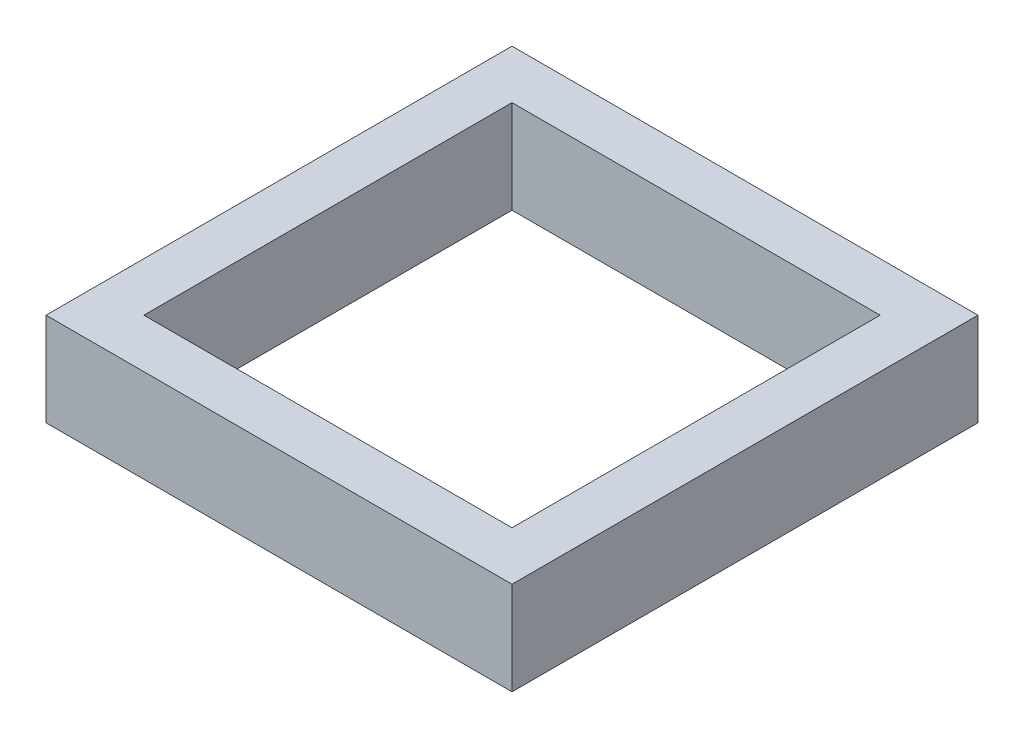
ISO-10303-21;
HEADER;
FILE_DESCRIPTION(('STEP AP214'),'2;1');
FILE_NAME('part.step','',(''),(''),'','','');
FILE_SCHEMA(('AUTOMOTIVE_DESIGN { 1 0 10303 214 1 1 1 1 }'));
ENDSEC;
DATA;
#1=APPLICATION_CONTEXT('core data for automotive mechanical design processes');
#2=APPLICATION_PROTOCOL_DEFINITION('international standard','automotive_design',2000,#1);
#3=PRODUCT_CONTEXT('',#1,'mechanical');
#4=PRODUCT('Part','Part','',(#3));
#5=PRODUCT_RELATED_PRODUCT_CATEGORY('part','',(#4));
#6=PRODUCT_DEFINITION_FORMATION('','',#4);
#7=PRODUCT_DEFINITION_CONTEXT('part definition',#1,'design');
#8=PRODUCT_DEFINITION('design','',#6,#7);
#9=PRODUCT_DEFINITION_SHAPE('','',#8);
#10=(LENGTH_UNIT() NAMED_UNIT(*) SI_UNIT(.MILLI.,.METRE.));
#11=(NAMED_UNIT(*) PLANE_ANGLE_UNIT() SI_UNIT($,.RADIAN.));
#12=(NAMED_UNIT(*) SI_UNIT($,.STERADIAN.) SOLID_ANGLE_UNIT());
#13=UNCERTAINTY_MEASURE_WITH_UNIT(LENGTH_MEASURE(1.E-05),#10,'distance_accuracy_value','');
#14=(GEOMETRIC_REPRESENTATION_CONTEXT(3) GLOBAL_UNCERTAINTY_ASSIGNED_CONTEXT((#13)) GLOBAL_UNIT_ASSIGNED_CONTEXT((#10,
#11,#12)) REPRESENTATION_CONTEXT('',''));
#15=CARTESIAN_POINT('',(0.,0.,0.));
#16=DIRECTION('',(0.,0.,1.));
#17=DIRECTION('',(1.,0.,0.));
#18=AXIS2_PLACEMENT_3D('',#15,#16,#17);
#19=CARTESIAN_POINT('',(0.,40.,0.));
#20=DIRECTION('',(0.,1.,0.));
#21=DIRECTION('',(0.,0.,1.));
#22=AXIS2_PLACEMENT_3D('',#19,#20,#21);
#23=PLANE('',#22);
#24=DIRECTION('',(0.,0.,-1.));
#25=VECTOR('',#24,1.);
#26=CARTESIAN_POINT('',(100.,40.,-100.));
#27=LINE('',#26,#25);
#28=CARTESIAN_POINT('',(100.,40.,100.));
#29=VERTEX_POINT('',#28);
#30=CARTESIAN_POINT('',(100.,40.,-100.));
#31=VERTEX_POINT('',#30);
#32=EDGE_CURVE('E136',#29,#31,#27,.T.);
#33=ORIENTED_EDGE('',*,*,#32,.T.);
#34=DIRECTION('',(-1.,0.,0.));
#35=VECTOR('',#34,1.);
#36=CARTESIAN_POINT('',(-100.,40.,-100.));
#37=LINE('',#36,#35);
#38=CARTESIAN_POINT('',(-100.,40.,-100.));
#39=VERTEX_POINT('',#38);
#40=EDGE_CURVE('E139',#31,#39,#37,.T.);
#41=ORIENTED_EDGE('',*,*,#40,.T.);
#42=DIRECTION('',(0.,0.,1.));
#43=VECTOR('',#42,1.);
#44=CARTESIAN_POINT('',(-100.,40.,-100.));
#45=LINE('',#44,#43);
#46=CARTESIAN_POINT('',(-100.,40.,100.));
#47=VERTEX_POINT('',#46);
#48=EDGE_CURVE('E142',#39,#47,#45,.T.);
#49=ORIENTED_EDGE('',*,*,#48,.T.);
#50=DIRECTION('',(1.,0.,0.));
#51=VECTOR('',#50,1.);
#52=CARTESIAN_POINT('',(-100.,40.,100.));
#53=LINE('',#52,#51);
#54=EDGE_CURVE('E144',#47,#29,#53,.T.);
#55=ORIENTED_EDGE('',*,*,#54,.T.);
#56=EDGE_LOOP('',(#33,#41,#49,#55));
#57=FACE_BOUND('',#56,.T.);
#58=DIRECTION('',(-1.,0.,0.));
#59=VECTOR('',#58,1.);
#60=CARTESIAN_POINT('',(-79.0000000000001,40.,-79.));
#61=LINE('',#60,#59);
#62=CARTESIAN_POINT('',(78.9999999999999,40.,-79.));
#63=VERTEX_POINT('',#62);
#64=CARTESIAN_POINT('',(-79.0000000000001,40.,-79.));
#65=VERTEX_POINT('',#64);
#66=EDGE_CURVE('E108',#63,#65,#61,.T.);
#67=ORIENTED_EDGE('',*,*,#66,.F.);
#68=DIRECTION('',(0.,0.,-1.));
#69=VECTOR('',#68,1.);
#70=CARTESIAN_POINT('',(78.9999999999999,40.,-79.));
#71=LINE('',#70,#69);
#72=CARTESIAN_POINT('',(79.,40.,79.));
#73=VERTEX_POINT('',#72);
#74=EDGE_CURVE('E100',#73,#63,#71,.T.);
#75=ORIENTED_EDGE('',*,*,#74,.F.);
#76=DIRECTION('',(1.,0.,0.));
#77=VECTOR('',#76,1.);
#78=CARTESIAN_POINT('',(-79.0000000000001,40.,79.));
#79=LINE('',#78,#77);
#80=CARTESIAN_POINT('',(-79.0000000000001,40.,79.));
#81=VERTEX_POINT('',#80);
#82=EDGE_CURVE('E122',#81,#73,#79,.T.);
#83=ORIENTED_EDGE('',*,*,#82,.F.);
#84=DIRECTION('',(0.,0.,1.));
#85=VECTOR('',#84,1.);
#86=CARTESIAN_POINT('',(-79.0000000000001,40.,-79.));
#87=LINE('',#86,#85);
#88=EDGE_CURVE('E120',#65,#81,#87,.T.);
#89=ORIENTED_EDGE('',*,*,#88,.F.);
#90=EDGE_LOOP('',(#67,#75,#83,#89));
#91=FACE_BOUND('',#90,.T.);
#92=ADVANCED_FACE('F35',(#57,#91),#23,.T.);
#93=CARTESIAN_POINT('',(0.,0.,0.));
#94=DIRECTION('',(0.,1.,0.));
#95=DIRECTION('',(0.,0.,1.));
#96=AXIS2_PLACEMENT_3D('',#93,#94,#95);
#97=PLANE('',#96);
#98=DIRECTION('',(0.,0.,-1.));
#99=VECTOR('',#98,1.);
#100=CARTESIAN_POINT('',(100.,0.,-100.));
#101=LINE('',#100,#99);
#102=CARTESIAN_POINT('',(100.,0.,100.));
#103=VERTEX_POINT('',#102);
#104=CARTESIAN_POINT('',(100.,0.,-100.));
#105=VERTEX_POINT('',#104);
#106=EDGE_CURVE('E116',#103,#105,#101,.T.);
#107=ORIENTED_EDGE('',*,*,#106,.F.);
#108=DIRECTION('',(1.,0.,0.));
#109=VECTOR('',#108,1.);
#110=CARTESIAN_POINT('',(-100.,0.,100.));
#111=LINE('',#110,#109);
#112=CARTESIAN_POINT('',(-100.,0.,100.));
#113=VERTEX_POINT('',#112);
#114=EDGE_CURVE('E140',#113,#103,#111,.T.);
#115=ORIENTED_EDGE('',*,*,#114,.F.);
#116=DIRECTION('',(0.,0.,1.));
#117=VECTOR('',#116,1.);
#118=CARTESIAN_POINT('',(-100.,0.,-100.));
#119=LINE('',#118,#117);
#120=CARTESIAN_POINT('',(-100.,0.,-100.));
#121=VERTEX_POINT('',#120);
#122=EDGE_CURVE('E151',#121,#113,#119,.T.);
#123=ORIENTED_EDGE('',*,*,#122,.F.);
#124=DIRECTION('',(-1.,0.,0.));
#125=VECTOR('',#124,1.);
#126=CARTESIAN_POINT('',(-100.,0.,-100.));
#127=LINE('',#126,#125);
#128=EDGE_CURVE('E149',#105,#121,#127,.T.);
#129=ORIENTED_EDGE('',*,*,#128,.F.);
#130=EDGE_LOOP('',(#107,#115,#123,#129));
#131=FACE_BOUND('',#130,.T.);
#132=DIRECTION('',(0.,0.,-1.));
#133=VECTOR('',#132,1.);
#134=CARTESIAN_POINT('',(78.9999999999999,0.,-79.));
#135=LINE('',#134,#133);
#136=CARTESIAN_POINT('',(79.,0.,79.));
#137=VERTEX_POINT('',#136);
#138=CARTESIAN_POINT('',(78.9999999999999,0.,-79.));
#139=VERTEX_POINT('',#138);
#140=EDGE_CURVE('E58',#137,#139,#135,.T.);
#141=ORIENTED_EDGE('',*,*,#140,.T.);
#142=DIRECTION('',(-1.,0.,0.));
#143=VECTOR('',#142,1.);
#144=CARTESIAN_POINT('',(-79.0000000000001,0.,-79.));
#145=LINE('',#144,#143);
#146=CARTESIAN_POINT('',(-79.0000000000001,0.,-79.));
#147=VERTEX_POINT('',#146);
#148=EDGE_CURVE('E115',#139,#147,#145,.T.);
#149=ORIENTED_EDGE('',*,*,#148,.T.);
#150=DIRECTION('',(0.,0.,1.));
#151=VECTOR('',#150,1.);
#152=CARTESIAN_POINT('',(-79.0000000000001,0.,-79.));
#153=LINE('',#152,#151);
#154=CARTESIAN_POINT('',(-79.0000000000001,0.,79.));
#155=VERTEX_POINT('',#154);
#156=EDGE_CURVE('E128',#147,#155,#153,.T.);
#157=ORIENTED_EDGE('',*,*,#156,.T.);
#158=DIRECTION('',(1.,0.,0.));
#159=VECTOR('',#158,1.);
#160=CARTESIAN_POINT('',(-79.0000000000001,0.,79.));
#161=LINE('',#160,#159);
#162=EDGE_CURVE('E109',#155,#137,#161,.T.);
#163=ORIENTED_EDGE('',*,*,#162,.T.);
#164=EDGE_LOOP('',(#141,#149,#157,#163));
#165=FACE_BOUND('',#164,.T.);
#166=ADVANCED_FACE('F169',(#131,#165),#97,.F.);
#167=CARTESIAN_POINT('',(100.,40.,-100.));
#168=DIRECTION('',(-1.,0.,0.));
#169=DIRECTION('',(0.,0.,1.));
#170=AXIS2_PLACEMENT_3D('',#167,#168,#169);
#171=PLANE('',#170);
#172=ORIENTED_EDGE('',*,*,#106,.T.);
#173=DIRECTION('',(0.,-1.,0.));
#174=VECTOR('',#173,1.);
#175=CARTESIAN_POINT('',(100.,40.,-100.));
#176=LINE('',#175,#174);
#177=EDGE_CURVE('E11',#31,#105,#176,.T.);
#178=ORIENTED_EDGE('',*,*,#177,.F.);
#179=ORIENTED_EDGE('',*,*,#32,.F.);
#180=DIRECTION('',(0.,-1.,0.));
#181=VECTOR('',#180,1.);
#182=CARTESIAN_POINT('',(100.,40.,100.));
#183=LINE('',#182,#181);
#184=EDGE_CURVE('E146',#29,#103,#183,.T.);
#185=ORIENTED_EDGE('',*,*,#184,.T.);
#186=EDGE_LOOP('',(#172,#178,#179,#185));
#187=FACE_BOUND('',#186,.T.);
#188=ADVANCED_FACE('F37',(#187),#171,.F.);
#189=CARTESIAN_POINT('',(-100.,40.,-100.));
#190=DIRECTION('',(0.,0.,1.));
#191=DIRECTION('',(1.,0.,0.));
#192=AXIS2_PLACEMENT_3D('',#189,#190,#191);
#193=PLANE('',#192);
#194=ORIENTED_EDGE('',*,*,#128,.T.);
#195=DIRECTION('',(0.,-1.,0.));
#196=VECTOR('',#195,1.);
#197=CARTESIAN_POINT('',(-100.,40.,-100.));
#198=LINE('',#197,#196);
#199=EDGE_CURVE('E43',#39,#121,#198,.T.);
#200=ORIENTED_EDGE('',*,*,#199,.F.);
#201=ORIENTED_EDGE('',*,*,#40,.F.);
#202=ORIENTED_EDGE('',*,*,#177,.T.);
#203=EDGE_LOOP('',(#194,#200,#201,#202));
#204=FACE_BOUND('',#203,.T.);
#205=ADVANCED_FACE('F179',(#204),#193,.F.);
#206=CARTESIAN_POINT('',(-100.,40.,-100.));
#207=DIRECTION('',(1.,0.,0.));
#208=DIRECTION('',(0.,0.,-1.));
#209=AXIS2_PLACEMENT_3D('',#206,#207,#208);
#210=PLANE('',#209);
#211=ORIENTED_EDGE('',*,*,#122,.T.);
#212=DIRECTION('',(0.,-1.,0.));
#213=VECTOR('',#212,1.);
#214=CARTESIAN_POINT('',(-100.,40.,100.));
#215=LINE('',#214,#213);
#216=EDGE_CURVE('E156',#47,#113,#215,.T.);
#217=ORIENTED_EDGE('',*,*,#216,.F.);
#218=ORIENTED_EDGE('',*,*,#48,.F.);
#219=ORIENTED_EDGE('',*,*,#199,.T.);
#220=EDGE_LOOP('',(#211,#217,#218,#219));
#221=FACE_BOUND('',#220,.T.);
#222=ADVANCED_FACE('F163',(#221),#210,.F.);
#223=CARTESIAN_POINT('',(-100.,40.,100.));
#224=DIRECTION('',(0.,0.,-1.));
#225=DIRECTION('',(-1.,0.,0.));
#226=AXIS2_PLACEMENT_3D('',#223,#224,#225);
#227=PLANE('',#226);
#228=ORIENTED_EDGE('',*,*,#114,.T.);
#229=ORIENTED_EDGE('',*,*,#184,.F.);
#230=ORIENTED_EDGE('',*,*,#54,.F.);
#231=ORIENTED_EDGE('',*,*,#216,.T.);
#232=EDGE_LOOP('',(#228,#229,#230,#231));
#233=FACE_BOUND('',#232,.T.);
#234=ADVANCED_FACE('F173',(#233),#227,.F.);
#235=CARTESIAN_POINT('',(78.9999999999999,40.,-79.));
#236=DIRECTION('',(-1.,0.,0.));
#237=DIRECTION('',(0.,0.,1.));
#238=AXIS2_PLACEMENT_3D('',#235,#236,#237);
#239=PLANE('',#238);
#240=ORIENTED_EDGE('',*,*,#140,.F.);
#241=DIRECTION('',(0.,-1.,0.));
#242=VECTOR('',#241,1.);
#243=CARTESIAN_POINT('',(79.,40.,79.));
#244=LINE('',#243,#242);
#245=EDGE_CURVE('E104',#73,#137,#244,.T.);
#246=ORIENTED_EDGE('',*,*,#245,.F.);
#247=ORIENTED_EDGE('',*,*,#74,.T.);
#248=DIRECTION('',(0.,-1.,0.));
#249=VECTOR('',#248,1.);
#250=CARTESIAN_POINT('',(78.9999999999999,40.,-79.));
#251=LINE('',#250,#249);
#252=EDGE_CURVE('E103',#63,#139,#251,.T.);
#253=ORIENTED_EDGE('',*,*,#252,.T.);
#254=EDGE_LOOP('',(#240,#246,#247,#253));
#255=FACE_BOUND('',#254,.T.);
#256=ADVANCED_FACE('F102',(#255),#239,.T.);
#257=CARTESIAN_POINT('',(-79.0000000000001,40.,-79.));
#258=DIRECTION('',(0.,0.,1.));
#259=DIRECTION('',(1.,0.,0.));
#260=AXIS2_PLACEMENT_3D('',#257,#258,#259);
#261=PLANE('',#260);
#262=ORIENTED_EDGE('',*,*,#148,.F.);
#263=ORIENTED_EDGE('',*,*,#252,.F.);
#264=ORIENTED_EDGE('',*,*,#66,.T.);
#265=DIRECTION('',(0.,-1.,0.));
#266=VECTOR('',#265,1.);
#267=CARTESIAN_POINT('',(-79.0000000000001,40.,-79.));
#268=LINE('',#267,#266);
#269=EDGE_CURVE('E117',#65,#147,#268,.T.);
#270=ORIENTED_EDGE('',*,*,#269,.T.);
#271=EDGE_LOOP('',(#262,#263,#264,#270));
#272=FACE_BOUND('',#271,.T.);
#273=ADVANCED_FACE('F112',(#272),#261,.T.);
#274=CARTESIAN_POINT('',(-79.0000000000001,40.,-79.));
#275=DIRECTION('',(1.,0.,0.));
#276=DIRECTION('',(0.,0.,-1.));
#277=AXIS2_PLACEMENT_3D('',#274,#275,#276);
#278=PLANE('',#277);
#279=ORIENTED_EDGE('',*,*,#156,.F.);
#280=ORIENTED_EDGE('',*,*,#269,.F.);
#281=ORIENTED_EDGE('',*,*,#88,.T.);
#282=DIRECTION('',(0.,-1.,0.));
#283=VECTOR('',#282,1.);
#284=CARTESIAN_POINT('',(-79.0000000000001,40.,79.));
#285=LINE('',#284,#283);
#286=EDGE_CURVE('E50',#81,#155,#285,.T.);
#287=ORIENTED_EDGE('',*,*,#286,.T.);
#288=EDGE_LOOP('',(#279,#280,#281,#287));
#289=FACE_BOUND('',#288,.T.);
#290=ADVANCED_FACE('F202',(#289),#278,.T.);
#291=CARTESIAN_POINT('',(-79.0000000000001,40.,79.));
#292=DIRECTION('',(0.,0.,-1.));
#293=DIRECTION('',(-1.,0.,0.));
#294=AXIS2_PLACEMENT_3D('',#291,#292,#293);
#295=PLANE('',#294);
#296=ORIENTED_EDGE('',*,*,#162,.F.);
#297=ORIENTED_EDGE('',*,*,#286,.F.);
#298=ORIENTED_EDGE('',*,*,#82,.T.);
#299=ORIENTED_EDGE('',*,*,#245,.T.);
#300=EDGE_LOOP('',(#296,#297,#298,#299));
#301=FACE_BOUND('',#300,.T.);
#302=ADVANCED_FACE('F206',(#301),#295,.T.);
#303=CLOSED_SHELL('',(#92,#166,#188,#205,#222,#234,#256,#273,#290,#302));
#304=MANIFOLD_SOLID_BREP('B2',#303);
#305=ADVANCED_BREP_SHAPE_REPRESENTATION('',(#18,#304),#14);
#306=SHAPE_DEFINITION_REPRESENTATION(#9,#305);
ENDSEC;
END-ISO-10303-21;
